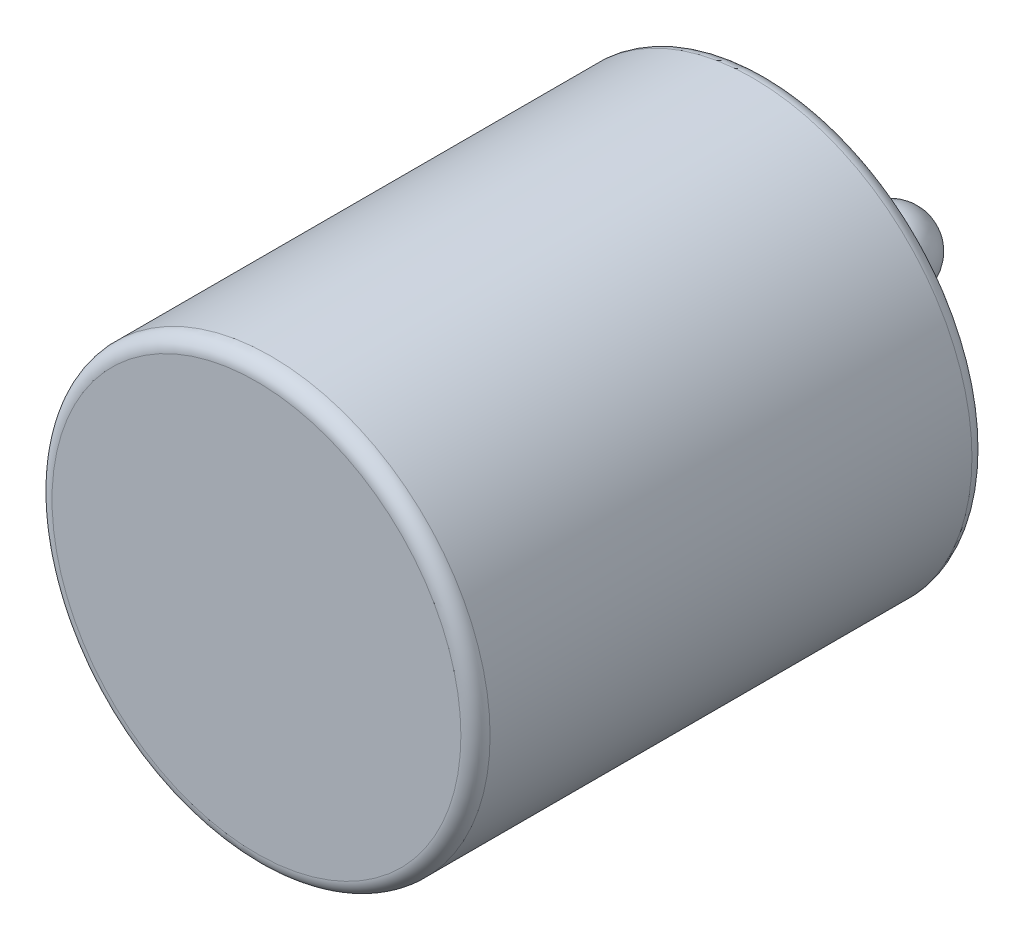
ISO-10303-21;
HEADER;
FILE_DESCRIPTION(('STEP AP214'),'2;1');
FILE_NAME('part.step','',(''),(''),'','','');
FILE_SCHEMA(('AUTOMOTIVE_DESIGN { 1 0 10303 214 1 1 1 1 }'));
ENDSEC;
DATA;
#1=APPLICATION_CONTEXT('core data for automotive mechanical design processes');
#2=APPLICATION_PROTOCOL_DEFINITION('international standard','automotive_design',2000,#1);
#3=PRODUCT_CONTEXT('',#1,'mechanical');
#4=PRODUCT('Part','Part','',(#3));
#5=PRODUCT_RELATED_PRODUCT_CATEGORY('part','',(#4));
#6=PRODUCT_DEFINITION_FORMATION('','',#4);
#7=PRODUCT_DEFINITION_CONTEXT('part definition',#1,'design');
#8=PRODUCT_DEFINITION('design','',#6,#7);
#9=PRODUCT_DEFINITION_SHAPE('','',#8);
#10=(LENGTH_UNIT() NAMED_UNIT(*) SI_UNIT(.MILLI.,.METRE.));
#11=(NAMED_UNIT(*) PLANE_ANGLE_UNIT() SI_UNIT($,.RADIAN.));
#12=(NAMED_UNIT(*) SI_UNIT($,.STERADIAN.) SOLID_ANGLE_UNIT());
#13=UNCERTAINTY_MEASURE_WITH_UNIT(LENGTH_MEASURE(1.E-05),#10,'distance_accuracy_value','');
#14=(GEOMETRIC_REPRESENTATION_CONTEXT(3) GLOBAL_UNCERTAINTY_ASSIGNED_CONTEXT((#13)) GLOBAL_UNIT_ASSIGNED_CONTEXT((#10,
#11,#12)) REPRESENTATION_CONTEXT('',''));
#15=CARTESIAN_POINT('',(0.,0.,0.));
#16=DIRECTION('',(0.,0.,1.));
#17=DIRECTION('',(1.,0.,0.));
#18=AXIS2_PLACEMENT_3D('',#15,#16,#17);
#19=CARTESIAN_POINT('',(0.,0.,7.));
#20=DIRECTION('',(0.,0.,-1.));
#21=DIRECTION('',(-1.,0.,0.));
#22=AXIS2_PLACEMENT_3D('',#19,#20,#21);
#23=CYLINDRICAL_SURFACE('',#22,3.);
#24=CARTESIAN_POINT('',(0.,0.,0.2));
#25=DIRECTION('',(0.,0.,1.));
#26=DIRECTION('',(1.,0.,0.));
#27=AXIS2_PLACEMENT_3D('',#24,#25,#26);
#28=CIRCLE('',#27,3.);
#29=CARTESIAN_POINT('',(-3.,0.,0.2));
#30=VERTEX_POINT('',#29);
#31=EDGE_CURVE('E42',#30,#30,#28,.T.);
#32=CARTESIAN_POINT('',(0.,0.,6.8));
#33=DIRECTION('',(0.,0.,1.));
#34=DIRECTION('',(1.,0.,0.));
#35=AXIS2_PLACEMENT_3D('',#32,#33,#34);
#36=CIRCLE('',#35,3.);
#37=CARTESIAN_POINT('',(-3.,0.,6.8));
#38=VERTEX_POINT('',#37);
#39=EDGE_CURVE('E46',#38,#38,#36,.F.);
#40=CARTESIAN_POINT('',(-3.,0.,0.2));
#41=CARTESIAN_POINT('',(-3.,0.,0.26875));
#42=CARTESIAN_POINT('',(-3.,0.,0.3375));
#43=CARTESIAN_POINT('',(-3.,0.,0.474999999999999));
#44=CARTESIAN_POINT('',(-3.,0.,0.543749999999999));
#45=CARTESIAN_POINT('',(-3.,0.,0.681249999999999));
#46=CARTESIAN_POINT('',(-3.,0.,0.749999999999999));
#47=CARTESIAN_POINT('',(-3.,0.,0.887499999999999));
#48=CARTESIAN_POINT('',(-3.,0.,0.95625));
#49=CARTESIAN_POINT('',(-3.,0.,1.09375));
#50=CARTESIAN_POINT('',(-3.,0.,1.1625));
#51=CARTESIAN_POINT('',(-3.,0.,1.3));
#52=CARTESIAN_POINT('',(-3.,0.,1.36875));
#53=CARTESIAN_POINT('',(-3.,0.,1.50625));
#54=CARTESIAN_POINT('',(-3.,0.,1.575));
#55=CARTESIAN_POINT('',(-3.,0.,1.7125));
#56=CARTESIAN_POINT('',(-3.,0.,1.78125));
#57=CARTESIAN_POINT('',(-3.,0.,1.91875));
#58=CARTESIAN_POINT('',(-3.,0.,1.9875));
#59=CARTESIAN_POINT('',(-3.,0.,2.125));
#60=CARTESIAN_POINT('',(-3.,0.,2.19375));
#61=CARTESIAN_POINT('',(-3.,0.,2.33125));
#62=CARTESIAN_POINT('',(-3.,0.,2.4));
#63=CARTESIAN_POINT('',(-3.,0.,2.5375));
#64=CARTESIAN_POINT('',(-3.,0.,2.60625));
#65=CARTESIAN_POINT('',(-3.,0.,2.74375));
#66=CARTESIAN_POINT('',(-3.,0.,2.8125));
#67=CARTESIAN_POINT('',(-3.,0.,2.95));
#68=CARTESIAN_POINT('',(-3.,0.,3.01875));
#69=CARTESIAN_POINT('',(-3.,0.,3.15625));
#70=CARTESIAN_POINT('',(-3.,0.,3.225));
#71=CARTESIAN_POINT('',(-3.,0.,3.3625));
#72=CARTESIAN_POINT('',(-3.,0.,3.43125));
#73=CARTESIAN_POINT('',(-3.,0.,3.56875));
#74=CARTESIAN_POINT('',(-3.,0.,3.6375));
#75=CARTESIAN_POINT('',(-3.,0.,3.775));
#76=CARTESIAN_POINT('',(-3.,0.,3.84375));
#77=CARTESIAN_POINT('',(-3.,0.,3.98125));
#78=CARTESIAN_POINT('',(-3.,0.,4.05));
#79=CARTESIAN_POINT('',(-3.,0.,4.1875));
#80=CARTESIAN_POINT('',(-3.,0.,4.25625));
#81=CARTESIAN_POINT('',(-3.,0.,4.39375));
#82=CARTESIAN_POINT('',(-3.,0.,4.4625));
#83=CARTESIAN_POINT('',(-3.,0.,4.6));
#84=CARTESIAN_POINT('',(-3.,0.,4.66875));
#85=CARTESIAN_POINT('',(-3.,0.,4.80625));
#86=CARTESIAN_POINT('',(-3.,0.,4.875));
#87=CARTESIAN_POINT('',(-3.,0.,5.0125));
#88=CARTESIAN_POINT('',(-3.,0.,5.08125));
#89=CARTESIAN_POINT('',(-3.,0.,5.21875));
#90=CARTESIAN_POINT('',(-3.,0.,5.2875));
#91=CARTESIAN_POINT('',(-3.,0.,5.425));
#92=CARTESIAN_POINT('',(-3.,0.,5.49375));
#93=CARTESIAN_POINT('',(-3.,0.,5.63125));
#94=CARTESIAN_POINT('',(-3.,0.,5.7));
#95=CARTESIAN_POINT('',(-3.,0.,5.8375));
#96=CARTESIAN_POINT('',(-3.,0.,5.90625));
#97=CARTESIAN_POINT('',(-3.,0.,6.04375));
#98=CARTESIAN_POINT('',(-3.,0.,6.1125));
#99=CARTESIAN_POINT('',(-3.,0.,6.25));
#100=CARTESIAN_POINT('',(-3.,0.,6.31875));
#101=CARTESIAN_POINT('',(-3.,0.,6.45625));
#102=CARTESIAN_POINT('',(-3.,0.,6.525));
#103=CARTESIAN_POINT('',(-3.,0.,6.6625));
#104=CARTESIAN_POINT('',(-3.,0.,6.73125));
#105=CARTESIAN_POINT('',(-3.,0.,6.8));
#106=B_SPLINE_CURVE_WITH_KNOTS('',3,(#40,#41,#42,#43,#44,#45,#46,#47,#48,#49,#50,#51,#52,#53,
#54,#55,#56,#57,#58,#59,#60,#61,#62,#63,#64,#65,#66,#67,#68,#69,#70,#71,#72,#73,#74,#75,#76,#77,
#78,#79,#80,#81,#82,#83,#84,#85,#86,#87,#88,#89,#90,#91,#92,#93,#94,#95,#96,#97,#98,#99,#100,
#101,#102,#103,#104,#105),.UNSPECIFIED.,.F.,.F.,(4,2,2,2,2,2,2,2,2,2,2,2,2,2,2,2,2,2,2,2,2,2,2,
2,2,2,2,2,2,2,2,2,4),(0.,0.20625,0.4125,0.618749999999999,0.825,1.03125,1.2375,1.44375,1.65,
1.85625,2.0625,2.26875,2.475,2.68125,2.8875,3.09375,3.3,3.50625,3.7125,3.91875,4.125,4.33125,
4.5375,4.74375,4.95,5.15625,5.3625,5.56875,5.775,5.98125,6.1875,6.39375,6.6),.UNSPECIFIED.);
#107=EDGE_CURVE('BSEAM35',#30,#38,#106,.T.);
#108=ORIENTED_EDGE('',*,*,#31,.T.);
#109=ORIENTED_EDGE('',*,*,#39,.T.);
#110=ORIENTED_EDGE('',*,*,#107,.T.);
#111=ORIENTED_EDGE('',*,*,#107,.F.);
#112=EDGE_LOOP('',(#108,#110,#109,#111));
#113=FACE_BOUND('',#112,.T.);
#114=ADVANCED_FACE('F35',(#113),#23,.T.);
#115=CARTESIAN_POINT('',(0.,0.,7.));
#116=DIRECTION('',(0.,0.,1.));
#117=DIRECTION('',(1.,0.,0.));
#118=AXIS2_PLACEMENT_3D('',#115,#116,#117);
#119=PLANE('',#118);
#120=CARTESIAN_POINT('',(0.,0.,7.));
#121=DIRECTION('',(0.,0.,1.));
#122=DIRECTION('',(1.,0.,0.));
#123=AXIS2_PLACEMENT_3D('',#120,#121,#122);
#124=CIRCLE('',#123,2.8);
#125=CARTESIAN_POINT('',(2.8,0.,7.));
#126=VERTEX_POINT('',#125);
#127=EDGE_CURVE('E50',#126,#126,#124,.T.);
#128=ORIENTED_EDGE('',*,*,#127,.T.);
#129=EDGE_LOOP('',(#128));
#130=FACE_BOUND('',#129,.T.);
#131=ADVANCED_FACE('F73',(#130),#119,.T.);
#132=CARTESIAN_POINT('',(0.,0.,6.8));
#133=DIRECTION('',(0.,0.,1.));
#134=DIRECTION('',(1.,0.,0.));
#135=AXIS2_PLACEMENT_3D('',#132,#133,#134);
#136=TOROIDAL_SURFACE('',#135,2.8,0.2);
#137=ORIENTED_EDGE('',*,*,#39,.F.);
#138=EDGE_LOOP('',(#137));
#139=FACE_BOUND('',#138,.T.);
#140=ORIENTED_EDGE('',*,*,#127,.F.);
#141=EDGE_LOOP('',(#140));
#142=FACE_BOUND('',#141,.T.);
#143=ADVANCED_FACE('F69',(#139,#142),#136,.T.);
#144=CARTESIAN_POINT('',(0.,0.,0.2));
#145=DIRECTION('',(0.,0.,1.));
#146=DIRECTION('',(1.,0.,0.));
#147=AXIS2_PLACEMENT_3D('',#144,#145,#146);
#148=TOROIDAL_SURFACE('',#147,2.8,0.2);
#149=CARTESIAN_POINT('',(0.,0.,0.));
#150=DIRECTION('',(0.,0.,1.));
#151=DIRECTION('',(1.,0.,0.));
#152=AXIS2_PLACEMENT_3D('',#149,#150,#151);
#153=CIRCLE('',#152,2.8);
#154=CARTESIAN_POINT('',(2.8,0.,0.));
#155=VERTEX_POINT('',#154);
#156=EDGE_CURVE('E10',#155,#155,#153,.F.);
#157=ORIENTED_EDGE('',*,*,#156,.F.);
#158=EDGE_LOOP('',(#157));
#159=FACE_BOUND('',#158,.T.);
#160=ORIENTED_EDGE('',*,*,#31,.F.);
#161=EDGE_LOOP('',(#160));
#162=FACE_BOUND('',#161,.T.);
#163=ADVANCED_FACE('F37',(#159,#162),#148,.T.);
#164=CARTESIAN_POINT('',(0.,0.,0.));
#165=DIRECTION('',(0.,0.,1.));
#166=DIRECTION('',(1.,0.,0.));
#167=AXIS2_PLACEMENT_3D('',#164,#165,#166);
#168=CONICAL_SURFACE('',#167,2.8,1.08136278973449);
#169=CARTESIAN_POINT('',(0.,0.,-1.30569363007952));
#170=DIRECTION('',(0.,0.,-1.));
#171=DIRECTION('',(-1.,0.,0.));
#172=AXIS2_PLACEMENT_3D('',#169,#170,#171);
#173=CIRCLE('',#172,0.348733134303344);
#174=CARTESIAN_POINT('',(0.348733134303344,0.,-1.30569363007952));
#175=VERTEX_POINT('',#174);
#176=EDGE_CURVE('E55',#175,#175,#173,.T.);
#177=CARTESIAN_POINT('',(0.348733134303344,0.,-1.30569363007952));
#178=CARTESIAN_POINT('',(0.37426716415435,0.,-1.29209265476619));
#179=CARTESIAN_POINT('',(0.399801194005357,0.,-1.27849167945286));
#180=CARTESIAN_POINT('',(0.450869253707371,0.,-1.25128972882621));
#181=CARTESIAN_POINT('',(0.476403283558378,0.,-1.23768875351288));
#182=CARTESIAN_POINT('',(0.527471343260391,0.,-1.21048680288622));
#183=CARTESIAN_POINT('',(0.553005373111398,0.,-1.19688582757289));
#184=CARTESIAN_POINT('',(0.604073432813412,0.,-1.16968387694624));
#185=CARTESIAN_POINT('',(0.629607462664418,0.,-1.15608290163291));
#186=CARTESIAN_POINT('',(0.680675522366432,0.,-1.12888095100625));
#187=CARTESIAN_POINT('',(0.706209552217439,0.,-1.11527997569292));
#188=CARTESIAN_POINT('',(0.757277611919453,0.,-1.08807802506627));
#189=CARTESIAN_POINT('',(0.78281164177046,0.,-1.07447704975294));
#190=CARTESIAN_POINT('',(0.833879701472473,0.,-1.04727509912628));
#191=CARTESIAN_POINT('',(0.85941373132348,0.,-1.03367412381295));
#192=CARTESIAN_POINT('',(0.910481791025494,0.,-1.0064721731863));
#193=CARTESIAN_POINT('',(0.936015820876501,0.,-0.992871197872969));
#194=CARTESIAN_POINT('',(0.987083880578515,0.,-0.965669247246312));
#195=CARTESIAN_POINT('',(1.01261791042952,0.,-0.952068271932984));
#196=CARTESIAN_POINT('',(1.06368597013153,0.,-0.924866321306327));
#197=CARTESIAN_POINT('',(1.08921999998254,0.,-0.911265345992999));
#198=CARTESIAN_POINT('',(1.14028805968456,0.,-0.884063395366342));
#199=CARTESIAN_POINT('',(1.16582208953556,0.,-0.870462420053014));
#200=CARTESIAN_POINT('',(1.21689014923758,0.,-0.843260469426357));
#201=CARTESIAN_POINT('',(1.24242417908858,0.,-0.829659494113029));
#202=CARTESIAN_POINT('',(1.2934922387906,0.,-0.802457543486372));
#203=CARTESIAN_POINT('',(1.3190262686416,0.,-0.788856568173044));
#204=CARTESIAN_POINT('',(1.37009432834362,0.,-0.761654617546387));
#205=CARTESIAN_POINT('',(1.39562835819462,0.,-0.748053642233059));
#206=CARTESIAN_POINT('',(1.44669641789664,0.,-0.720851691606402));
#207=CARTESIAN_POINT('',(1.47223044774764,0.,-0.707250716293074));
#208=CARTESIAN_POINT('',(1.52329850744966,0.,-0.680048765666417));
#209=CARTESIAN_POINT('',(1.54883253730067,0.,-0.666447790353089));
#210=CARTESIAN_POINT('',(1.59990059700268,0.,-0.639245839726432));
#211=CARTESIAN_POINT('',(1.62543462685369,0.,-0.625644864413104));
#212=CARTESIAN_POINT('',(1.6765026865557,0.,-0.598442913786447));
#213=CARTESIAN_POINT('',(1.70203671640671,0.,-0.584841938473119));
#214=CARTESIAN_POINT('',(1.75310477610872,0.,-0.557639987846462));
#215=CARTESIAN_POINT('',(1.77863880595973,0.,-0.544039012533134));
#216=CARTESIAN_POINT('',(1.82970686566174,0.,-0.516837061906477));
#217=CARTESIAN_POINT('',(1.85524089551275,0.,-0.503236086593149));
#218=CARTESIAN_POINT('',(1.90630895521476,0.,-0.476034135966492));
#219=CARTESIAN_POINT('',(1.93184298506577,0.,-0.462433160653164));
#220=CARTESIAN_POINT('',(1.98291104476778,0.,-0.435231210026507));
#221=CARTESIAN_POINT('',(2.00844507461879,0.,-0.421630234713179));
#222=CARTESIAN_POINT('',(2.0595131343208,0.,-0.394428284086522));
#223=CARTESIAN_POINT('',(2.08504716417181,0.,-0.380827308773194));
#224=CARTESIAN_POINT('',(2.13611522387382,0.,-0.353625358146537));
#225=CARTESIAN_POINT('',(2.16164925372483,0.,-0.340024382833209));
#226=CARTESIAN_POINT('',(2.21271731342684,0.,-0.312822432206552));
#227=CARTESIAN_POINT('',(2.23825134327785,0.,-0.299221456893224));
#228=CARTESIAN_POINT('',(2.28931940297986,0.,-0.272019506266567));
#229=CARTESIAN_POINT('',(2.31485343283087,0.,-0.258418530953239));
#230=CARTESIAN_POINT('',(2.36592149253288,0.,-0.231216580326582));
#231=CARTESIAN_POINT('',(2.39145552238389,0.,-0.217615605013254));
#232=CARTESIAN_POINT('',(2.4425235820859,0.,-0.190413654386597));
#233=CARTESIAN_POINT('',(2.46805761193691,0.,-0.176812679073268));
#234=CARTESIAN_POINT('',(2.51912567163893,0.,-0.149610728446612));
#235=CARTESIAN_POINT('',(2.54465970148993,0.,-0.136009753133283));
#236=CARTESIAN_POINT('',(2.59572776119195,0.,-0.108807802506627));
#237=CARTESIAN_POINT('',(2.62126179104295,0.,-0.0952068271932984));
#238=CARTESIAN_POINT('',(2.67232985074497,0.,-0.0680048765666417));
#239=CARTESIAN_POINT('',(2.69786388059597,0.,-0.0544039012533133));
#240=CARTESIAN_POINT('',(2.74893194029799,0.,-0.0272019506266566));
#241=CARTESIAN_POINT('',(2.77446597014899,0.,-0.0136009753133282));
#242=CARTESIAN_POINT('',(2.8,0.,0.));
#243=B_SPLINE_CURVE_WITH_KNOTS('',3,(#177,#178,#179,#180,#181,#182,#183,#184,#185,#186,#187,
#188,#189,#190,#191,#192,#193,#194,#195,#196,#197,#198,#199,#200,#201,#202,#203,#204,#205,#206,
#207,#208,#209,#210,#211,#212,#213,#214,#215,#216,#217,#218,#219,#220,#221,#222,#223,#224,#225,
#226,#227,#228,#229,#230,#231,#232,#233,#234,#235,#236,#237,#238,#239,#240,#241,#242),
.UNSPECIFIED.,.F.,.F.,(4,2,2,2,2,2,2,2,2,2,2,2,2,2,2,2,2,2,2,2,2,2,2,2,2,2,2,2,2,2,2,2,4),(0.,
0.0867914678361464,0.173582935672293,0.26037440350844,0.347165871344586,0.433957339180733,
0.52074880701688,0.607540274853027,0.694331742689173,0.78112321052532,0.867914678361467,
0.954706146197613,1.04149761403376,1.12828908186991,1.21508054970605,1.3018720175422,
1.38866348537835,1.47545495321449,1.56224642105064,1.64903788888679,1.73582935672293,
1.82262082455908,1.90941229239523,1.99620376023137,2.08299522806752,2.16978669590367,
2.25657816373981,2.34336963157596,2.43016109941211,2.51695256724825,2.6037440350844,
2.69053550292054,2.77732697075669),.UNSPECIFIED.);
#244=EDGE_CURVE('BSEAM61',#175,#155,#243,.T.);
#245=ORIENTED_EDGE('',*,*,#176,.F.);
#246=ORIENTED_EDGE('',*,*,#156,.T.);
#247=ORIENTED_EDGE('',*,*,#244,.T.);
#248=ORIENTED_EDGE('',*,*,#244,.F.);
#249=EDGE_LOOP('',(#245,#247,#246,#248));
#250=FACE_BOUND('',#249,.T.);
#251=ADVANCED_FACE('F61',(#250),#168,.T.);
#252=CARTESIAN_POINT('',(0.,0.,-1.68485420884586));
#253=DIRECTION('',(0.,0.,-1.));
#254=DIRECTION('',(1.,0.,0.));
#255=AXIS2_PLACEMENT_3D('',#252,#253,#254);
#256=SPHERICAL_SURFACE('',#255,0.51514807914954);
#257=ORIENTED_EDGE('',*,*,#176,.T.);
#258=EDGE_LOOP('',(#257));
#259=FACE_BOUND('',#258,.T.);
#260=ADVANCED_FACE('F59',(#259),#256,.T.);
#261=CLOSED_SHELL('',(#114,#131,#143,#163,#251,#260));
#262=MANIFOLD_SOLID_BREP('B2',#261);
#263=ADVANCED_BREP_SHAPE_REPRESENTATION('',(#18,#262),#14);
#264=SHAPE_DEFINITION_REPRESENTATION(#9,#263);
ENDSEC;
END-ISO-10303-21;
